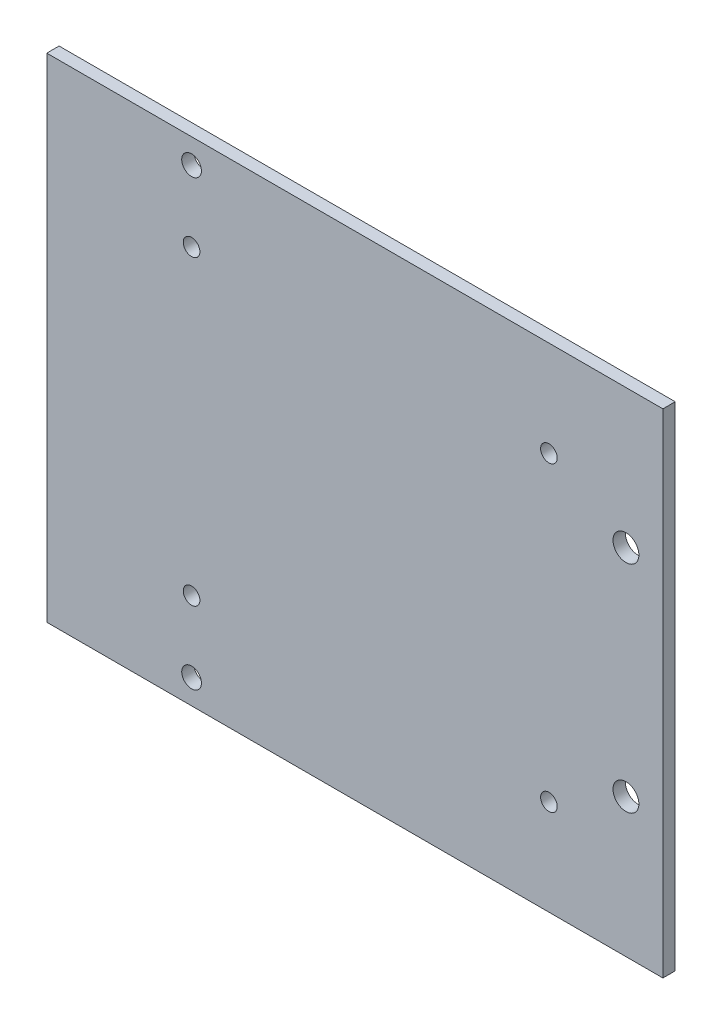
ISO-10303-21;
HEADER;
FILE_DESCRIPTION(('STEP AP214'),'2;1');
FILE_NAME('part.step','',(''),(''),'','','');
FILE_SCHEMA(('AUTOMOTIVE_DESIGN { 1 0 10303 214 1 1 1 1 }'));
ENDSEC;
DATA;
#1=APPLICATION_CONTEXT('core data for automotive mechanical design processes');
#2=APPLICATION_PROTOCOL_DEFINITION('international standard','automotive_design',2000,#1);
#3=PRODUCT_CONTEXT('',#1,'mechanical');
#4=PRODUCT('Part','Part','',(#3));
#5=PRODUCT_RELATED_PRODUCT_CATEGORY('part','',(#4));
#6=PRODUCT_DEFINITION_FORMATION('','',#4);
#7=PRODUCT_DEFINITION_CONTEXT('part definition',#1,'design');
#8=PRODUCT_DEFINITION('design','',#6,#7);
#9=PRODUCT_DEFINITION_SHAPE('','',#8);
#10=(LENGTH_UNIT() NAMED_UNIT(*) SI_UNIT(.MILLI.,.METRE.));
#11=(NAMED_UNIT(*) PLANE_ANGLE_UNIT() SI_UNIT($,.RADIAN.));
#12=(NAMED_UNIT(*) SI_UNIT($,.STERADIAN.) SOLID_ANGLE_UNIT());
#13=UNCERTAINTY_MEASURE_WITH_UNIT(LENGTH_MEASURE(1.E-05),#10,'distance_accuracy_value','');
#14=(GEOMETRIC_REPRESENTATION_CONTEXT(3) GLOBAL_UNCERTAINTY_ASSIGNED_CONTEXT((#13)) GLOBAL_UNIT_ASSIGNED_CONTEXT((#10,
#11,#12)) REPRESENTATION_CONTEXT('',''));
#15=CARTESIAN_POINT('',(0.,0.,0.));
#16=DIRECTION('',(0.,0.,1.));
#17=DIRECTION('',(1.,0.,0.));
#18=AXIS2_PLACEMENT_3D('',#15,#16,#17);
#19=CARTESIAN_POINT('',(0.,0.,2.));
#20=DIRECTION('',(0.,0.,1.));
#21=DIRECTION('',(1.,0.,0.));
#22=AXIS2_PLACEMENT_3D('',#19,#20,#21);
#23=PLANE('',#22);
#24=CARTESIAN_POINT('',(44.,-17.5,2.));
#25=DIRECTION('',(0.,0.,1.));
#26=DIRECTION('',(1.,0.,0.));
#27=AXIS2_PLACEMENT_3D('',#24,#25,#26);
#28=CIRCLE('',#27,2.09999999999999);
#29=CARTESIAN_POINT('',(46.1,-17.5,2.));
#30=VERTEX_POINT('',#29);
#31=EDGE_CURVE('E118',#30,#30,#28,.F.);
#32=ORIENTED_EDGE('',*,*,#31,.T.);
#33=EDGE_LOOP('',(#32));
#34=FACE_BOUND('',#33,.T.);
#35=CARTESIAN_POINT('',(-26.5,36.,2.));
#36=DIRECTION('',(0.,0.,1.));
#37=DIRECTION('',(1.,0.,0.));
#38=AXIS2_PLACEMENT_3D('',#35,#36,#37);
#39=CIRCLE('',#38,1.6);
#40=CARTESIAN_POINT('',(-24.9,36.,2.));
#41=VERTEX_POINT('',#40);
#42=EDGE_CURVE('E116',#41,#41,#39,.T.);
#43=ORIENTED_EDGE('',*,*,#42,.F.);
#44=EDGE_LOOP('',(#43));
#45=FACE_BOUND('',#44,.T.);
#46=CARTESIAN_POINT('',(-26.4999999999728,-36.0000000000007,2.));
#47=DIRECTION('',(0.,0.,-1.));
#48=DIRECTION('',(-1.,0.,0.));
#49=AXIS2_PLACEMENT_3D('',#46,#47,#48);
#50=CIRCLE('',#49,1.60000000001161);
#51=CARTESIAN_POINT('',(-28.0999999999844,-36.0000000000007,2.));
#52=VERTEX_POINT('',#51);
#53=EDGE_CURVE('E131',#52,#52,#50,.T.);
#54=ORIENTED_EDGE('',*,*,#53,.T.);
#55=EDGE_LOOP('',(#54));
#56=FACE_BOUND('',#55,.T.);
#57=CARTESIAN_POINT('',(-26.5,24.5,2.));
#58=DIRECTION('',(0.,0.,1.));
#59=DIRECTION('',(1.,0.,0.));
#60=AXIS2_PLACEMENT_3D('',#57,#58,#59);
#61=CIRCLE('',#60,1.35);
#62=CARTESIAN_POINT('',(-25.15,24.5,2.));
#63=VERTEX_POINT('',#62);
#64=EDGE_CURVE('E141',#63,#63,#61,.F.);
#65=ORIENTED_EDGE('',*,*,#64,.T.);
#66=EDGE_LOOP('',(#65));
#67=FACE_BOUND('',#66,.T.);
#68=CARTESIAN_POINT('',(-26.5,-24.5,2.));
#69=DIRECTION('',(0.,0.,1.));
#70=DIRECTION('',(1.,0.,0.));
#71=AXIS2_PLACEMENT_3D('',#68,#69,#70);
#72=CIRCLE('',#71,1.35);
#73=CARTESIAN_POINT('',(-25.15,-24.5,2.));
#74=VERTEX_POINT('',#73);
#75=EDGE_CURVE('E140',#74,#74,#72,.T.);
#76=ORIENTED_EDGE('',*,*,#75,.F.);
#77=EDGE_LOOP('',(#76));
#78=FACE_BOUND('',#77,.T.);
#79=DIRECTION('',(0.,1.,0.));
#80=VECTOR('',#79,1.);
#81=CARTESIAN_POINT('',(50.,40.,2.));
#82=LINE('',#81,#80);
#83=CARTESIAN_POINT('',(50.,-40.,2.));
#84=VERTEX_POINT('',#83);
#85=CARTESIAN_POINT('',(50.,40.,2.));
#86=VERTEX_POINT('',#85);
#87=EDGE_CURVE('E89',#84,#86,#82,.T.);
#88=ORIENTED_EDGE('',*,*,#87,.T.);
#89=DIRECTION('',(-1.,0.,0.));
#90=VECTOR('',#89,1.);
#91=CARTESIAN_POINT('',(-50.,40.,2.));
#92=LINE('',#91,#90);
#93=CARTESIAN_POINT('',(-50.,40.,2.));
#94=VERTEX_POINT('',#93);
#95=EDGE_CURVE('E84',#86,#94,#92,.T.);
#96=ORIENTED_EDGE('',*,*,#95,.T.);
#97=DIRECTION('',(0.,-1.,0.));
#98=VECTOR('',#97,1.);
#99=CARTESIAN_POINT('',(-50.,40.,2.));
#100=LINE('',#99,#98);
#101=CARTESIAN_POINT('',(-50.,-40.,2.));
#102=VERTEX_POINT('',#101);
#103=EDGE_CURVE('E87',#94,#102,#100,.T.);
#104=ORIENTED_EDGE('',*,*,#103,.T.);
#105=DIRECTION('',(1.,0.,0.));
#106=VECTOR('',#105,1.);
#107=CARTESIAN_POINT('',(-50.,-40.,2.));
#108=LINE('',#107,#106);
#109=EDGE_CURVE('E54',#102,#84,#108,.T.);
#110=ORIENTED_EDGE('',*,*,#109,.T.);
#111=EDGE_LOOP('',(#88,#96,#104,#110));
#112=FACE_BOUND('',#111,.T.);
#113=CARTESIAN_POINT('',(31.5,24.5,2.));
#114=DIRECTION('',(0.,0.,1.));
#115=DIRECTION('',(1.,0.,0.));
#116=AXIS2_PLACEMENT_3D('',#113,#114,#115);
#117=CIRCLE('',#116,1.35000000000001);
#118=CARTESIAN_POINT('',(32.85,24.5,2.));
#119=VERTEX_POINT('',#118);
#120=EDGE_CURVE('E147',#119,#119,#117,.T.);
#121=ORIENTED_EDGE('',*,*,#120,.F.);
#122=EDGE_LOOP('',(#121));
#123=FACE_BOUND('',#122,.T.);
#124=CARTESIAN_POINT('',(31.5,-24.5,2.));
#125=DIRECTION('',(0.,0.,1.));
#126=DIRECTION('',(1.,0.,0.));
#127=AXIS2_PLACEMENT_3D('',#124,#125,#126);
#128=CIRCLE('',#127,1.35000000000001);
#129=CARTESIAN_POINT('',(32.85,-24.5,2.));
#130=VERTEX_POINT('',#129);
#131=EDGE_CURVE('E134',#130,#130,#128,.F.);
#132=ORIENTED_EDGE('',*,*,#131,.T.);
#133=EDGE_LOOP('',(#132));
#134=FACE_BOUND('',#133,.T.);
#135=CARTESIAN_POINT('',(44.,17.5,2.));
#136=DIRECTION('',(0.,0.,1.));
#137=DIRECTION('',(1.,0.,0.));
#138=AXIS2_PLACEMENT_3D('',#135,#136,#137);
#139=CIRCLE('',#138,2.1);
#140=CARTESIAN_POINT('',(46.1,17.5,2.));
#141=VERTEX_POINT('',#140);
#142=EDGE_CURVE('E112',#141,#141,#139,.T.);
#143=ORIENTED_EDGE('',*,*,#142,.F.);
#144=EDGE_LOOP('',(#143));
#145=FACE_BOUND('',#144,.T.);
#146=ADVANCED_FACE('F35',(#34,#45,#56,#67,#78,#112,#123,#134,#145),#23,.T.);
#147=CARTESIAN_POINT('',(0.,0.,0.));
#148=DIRECTION('',(0.,0.,1.));
#149=DIRECTION('',(1.,0.,0.));
#150=AXIS2_PLACEMENT_3D('',#147,#148,#149);
#151=PLANE('',#150);
#152=CARTESIAN_POINT('',(31.5,-24.5,0.));
#153=DIRECTION('',(0.,0.,1.));
#154=DIRECTION('',(1.,0.,0.));
#155=AXIS2_PLACEMENT_3D('',#152,#153,#154);
#156=CIRCLE('',#155,1.35000000000001);
#157=CARTESIAN_POINT('',(32.85,-24.5,0.));
#158=VERTEX_POINT('',#157);
#159=EDGE_CURVE('E150',#158,#158,#156,.F.);
#160=ORIENTED_EDGE('',*,*,#159,.F.);
#161=EDGE_LOOP('',(#160));
#162=FACE_BOUND('',#161,.T.);
#163=CARTESIAN_POINT('',(-26.5,24.5,0.));
#164=DIRECTION('',(0.,0.,1.));
#165=DIRECTION('',(1.,0.,0.));
#166=AXIS2_PLACEMENT_3D('',#163,#164,#165);
#167=CIRCLE('',#166,1.35);
#168=CARTESIAN_POINT('',(-25.15,24.5,0.));
#169=VERTEX_POINT('',#168);
#170=EDGE_CURVE('E137',#169,#169,#167,.F.);
#171=ORIENTED_EDGE('',*,*,#170,.F.);
#172=EDGE_LOOP('',(#171));
#173=FACE_BOUND('',#172,.T.);
#174=DIRECTION('',(0.,1.,0.));
#175=VECTOR('',#174,1.);
#176=CARTESIAN_POINT('',(50.,40.,0.));
#177=LINE('',#176,#175);
#178=CARTESIAN_POINT('',(50.,-40.,0.));
#179=VERTEX_POINT('',#178);
#180=CARTESIAN_POINT('',(50.,40.,0.));
#181=VERTEX_POINT('',#180);
#182=EDGE_CURVE('E102',#179,#181,#177,.T.);
#183=ORIENTED_EDGE('',*,*,#182,.F.);
#184=DIRECTION('',(1.,0.,0.));
#185=VECTOR('',#184,1.);
#186=CARTESIAN_POINT('',(-50.,-40.,0.));
#187=LINE('',#186,#185);
#188=CARTESIAN_POINT('',(-50.,-40.,0.));
#189=VERTEX_POINT('',#188);
#190=EDGE_CURVE('E77',#189,#179,#187,.T.);
#191=ORIENTED_EDGE('',*,*,#190,.F.);
#192=DIRECTION('',(0.,-1.,0.));
#193=VECTOR('',#192,1.);
#194=CARTESIAN_POINT('',(-50.,40.,0.));
#195=LINE('',#194,#193);
#196=CARTESIAN_POINT('',(-50.,40.,0.));
#197=VERTEX_POINT('',#196);
#198=EDGE_CURVE('E71',#197,#189,#195,.T.);
#199=ORIENTED_EDGE('',*,*,#198,.F.);
#200=DIRECTION('',(-1.,0.,0.));
#201=VECTOR('',#200,1.);
#202=CARTESIAN_POINT('',(-50.,40.,0.));
#203=LINE('',#202,#201);
#204=EDGE_CURVE('E93',#181,#197,#203,.T.);
#205=ORIENTED_EDGE('',*,*,#204,.F.);
#206=EDGE_LOOP('',(#183,#191,#199,#205));
#207=FACE_BOUND('',#206,.T.);
#208=CARTESIAN_POINT('',(-26.5,-24.5,0.));
#209=DIRECTION('',(0.,0.,1.));
#210=DIRECTION('',(1.,0.,0.));
#211=AXIS2_PLACEMENT_3D('',#208,#209,#210);
#212=CIRCLE('',#211,1.35);
#213=CARTESIAN_POINT('',(-25.15,-24.5,0.));
#214=VERTEX_POINT('',#213);
#215=EDGE_CURVE('E105',#214,#214,#212,.T.);
#216=ORIENTED_EDGE('',*,*,#215,.T.);
#217=EDGE_LOOP('',(#216));
#218=FACE_BOUND('',#217,.T.);
#219=CARTESIAN_POINT('',(31.5,24.5,0.));
#220=DIRECTION('',(0.,0.,1.));
#221=DIRECTION('',(1.,0.,0.));
#222=AXIS2_PLACEMENT_3D('',#219,#220,#221);
#223=CIRCLE('',#222,1.35000000000001);
#224=CARTESIAN_POINT('',(32.85,24.5,0.));
#225=VERTEX_POINT('',#224);
#226=EDGE_CURVE('E144',#225,#225,#223,.T.);
#227=ORIENTED_EDGE('',*,*,#226,.T.);
#228=EDGE_LOOP('',(#227));
#229=FACE_BOUND('',#228,.T.);
#230=CARTESIAN_POINT('',(-26.4999999999728,-36.0000000000007,0.));
#231=DIRECTION('',(0.,0.,-1.));
#232=DIRECTION('',(-1.,0.,0.));
#233=AXIS2_PLACEMENT_3D('',#230,#231,#232);
#234=CIRCLE('',#233,1.60000000001161);
#235=CARTESIAN_POINT('',(-28.0999999999844,-36.0000000000007,0.));
#236=VERTEX_POINT('',#235);
#237=EDGE_CURVE('E128',#236,#236,#234,.T.);
#238=ORIENTED_EDGE('',*,*,#237,.F.);
#239=EDGE_LOOP('',(#238));
#240=FACE_BOUND('',#239,.T.);
#241=CARTESIAN_POINT('',(-26.5,36.,0.));
#242=DIRECTION('',(0.,0.,1.));
#243=DIRECTION('',(1.,0.,0.));
#244=AXIS2_PLACEMENT_3D('',#241,#242,#243);
#245=CIRCLE('',#244,1.6);
#246=CARTESIAN_POINT('',(-24.9,36.,0.));
#247=VERTEX_POINT('',#246);
#248=EDGE_CURVE('E125',#247,#247,#245,.T.);
#249=ORIENTED_EDGE('',*,*,#248,.T.);
#250=EDGE_LOOP('',(#249));
#251=FACE_BOUND('',#250,.T.);
#252=CARTESIAN_POINT('',(44.,-17.5,0.));
#253=DIRECTION('',(0.,0.,1.));
#254=DIRECTION('',(1.,0.,0.));
#255=AXIS2_PLACEMENT_3D('',#252,#253,#254);
#256=CIRCLE('',#255,2.09999999999999);
#257=CARTESIAN_POINT('',(46.1,-17.5,0.));
#258=VERTEX_POINT('',#257);
#259=EDGE_CURVE('E110',#258,#258,#256,.F.);
#260=ORIENTED_EDGE('',*,*,#259,.F.);
#261=EDGE_LOOP('',(#260));
#262=FACE_BOUND('',#261,.T.);
#263=CARTESIAN_POINT('',(44.,17.5,0.));
#264=DIRECTION('',(0.,0.,1.));
#265=DIRECTION('',(1.,0.,0.));
#266=AXIS2_PLACEMENT_3D('',#263,#264,#265);
#267=CIRCLE('',#266,2.1);
#268=CARTESIAN_POINT('',(46.1,17.5,0.));
#269=VERTEX_POINT('',#268);
#270=EDGE_CURVE('E39',#269,#269,#267,.T.);
#271=ORIENTED_EDGE('',*,*,#270,.T.);
#272=EDGE_LOOP('',(#271));
#273=FACE_BOUND('',#272,.T.);
#274=ADVANCED_FACE('F163',(#162,#173,#207,#218,#229,#240,#251,#262,#273),#151,.F.);
#275=CARTESIAN_POINT('',(50.,40.,2.));
#276=DIRECTION('',(-1.,0.,0.));
#277=DIRECTION('',(0.,-1.,0.));
#278=AXIS2_PLACEMENT_3D('',#275,#276,#277);
#279=PLANE('',#278);
#280=ORIENTED_EDGE('',*,*,#182,.T.);
#281=DIRECTION('',(0.,0.,-1.));
#282=VECTOR('',#281,1.);
#283=CARTESIAN_POINT('',(50.,40.,2.));
#284=LINE('',#283,#282);
#285=EDGE_CURVE('E11',#86,#181,#284,.T.);
#286=ORIENTED_EDGE('',*,*,#285,.F.);
#287=ORIENTED_EDGE('',*,*,#87,.F.);
#288=DIRECTION('',(0.,0.,-1.));
#289=VECTOR('',#288,1.);
#290=CARTESIAN_POINT('',(50.,-40.,2.));
#291=LINE('',#290,#289);
#292=EDGE_CURVE('E98',#84,#179,#291,.T.);
#293=ORIENTED_EDGE('',*,*,#292,.T.);
#294=EDGE_LOOP('',(#280,#286,#287,#293));
#295=FACE_BOUND('',#294,.T.);
#296=ADVANCED_FACE('F37',(#295),#279,.F.);
#297=CARTESIAN_POINT('',(-50.,40.,2.));
#298=DIRECTION('',(0.,-1.,0.));
#299=DIRECTION('',(0.,0.,-1.));
#300=AXIS2_PLACEMENT_3D('',#297,#298,#299);
#301=PLANE('',#300);
#302=ORIENTED_EDGE('',*,*,#204,.T.);
#303=DIRECTION('',(0.,0.,-1.));
#304=VECTOR('',#303,1.);
#305=CARTESIAN_POINT('',(-50.,40.,2.));
#306=LINE('',#305,#304);
#307=EDGE_CURVE('E45',#94,#197,#306,.T.);
#308=ORIENTED_EDGE('',*,*,#307,.F.);
#309=ORIENTED_EDGE('',*,*,#95,.F.);
#310=ORIENTED_EDGE('',*,*,#285,.T.);
#311=EDGE_LOOP('',(#302,#308,#309,#310));
#312=FACE_BOUND('',#311,.T.);
#313=ADVANCED_FACE('F92',(#312),#301,.F.);
#314=CARTESIAN_POINT('',(-50.,40.,2.));
#315=DIRECTION('',(1.,0.,0.));
#316=DIRECTION('',(0.,1.,0.));
#317=AXIS2_PLACEMENT_3D('',#314,#315,#316);
#318=PLANE('',#317);
#319=ORIENTED_EDGE('',*,*,#198,.T.);
#320=DIRECTION('',(0.,0.,-1.));
#321=VECTOR('',#320,1.);
#322=CARTESIAN_POINT('',(-50.,-40.,2.));
#323=LINE('',#322,#321);
#324=EDGE_CURVE('E94',#102,#189,#323,.T.);
#325=ORIENTED_EDGE('',*,*,#324,.F.);
#326=ORIENTED_EDGE('',*,*,#103,.F.);
#327=ORIENTED_EDGE('',*,*,#307,.T.);
#328=EDGE_LOOP('',(#319,#325,#326,#327));
#329=FACE_BOUND('',#328,.T.);
#330=ADVANCED_FACE('F96',(#329),#318,.F.);
#331=CARTESIAN_POINT('',(-50.,-40.,2.));
#332=DIRECTION('',(0.,1.,0.));
#333=DIRECTION('',(0.,0.,1.));
#334=AXIS2_PLACEMENT_3D('',#331,#332,#333);
#335=PLANE('',#334);
#336=ORIENTED_EDGE('',*,*,#190,.T.);
#337=ORIENTED_EDGE('',*,*,#292,.F.);
#338=ORIENTED_EDGE('',*,*,#109,.F.);
#339=ORIENTED_EDGE('',*,*,#324,.T.);
#340=EDGE_LOOP('',(#336,#337,#338,#339));
#341=FACE_BOUND('',#340,.T.);
#342=ADVANCED_FACE('F176',(#341),#335,.F.);
#343=CARTESIAN_POINT('',(-26.5,-24.5,0.));
#344=DIRECTION('',(0.,0.,1.));
#345=DIRECTION('',(1.,0.,0.));
#346=AXIS2_PLACEMENT_3D('',#343,#344,#345);
#347=CYLINDRICAL_SURFACE('',#346,1.35);
#348=ORIENTED_EDGE('',*,*,#215,.F.);
#349=EDGE_LOOP('',(#348));
#350=FACE_BOUND('',#349,.T.);
#351=ORIENTED_EDGE('',*,*,#75,.T.);
#352=EDGE_LOOP('',(#351));
#353=FACE_BOUND('',#352,.T.);
#354=ADVANCED_FACE('F160',(#350,#353),#347,.F.);
#355=CARTESIAN_POINT('',(-26.5,24.5,0.));
#356=DIRECTION('',(0.,0.,1.));
#357=DIRECTION('',(1.,0.,0.));
#358=AXIS2_PLACEMENT_3D('',#355,#356,#357);
#359=CYLINDRICAL_SURFACE('',#358,1.35);
#360=ORIENTED_EDGE('',*,*,#170,.T.);
#361=EDGE_LOOP('',(#360));
#362=FACE_BOUND('',#361,.T.);
#363=ORIENTED_EDGE('',*,*,#64,.F.);
#364=EDGE_LOOP('',(#363));
#365=FACE_BOUND('',#364,.T.);
#366=ADVANCED_FACE('F220',(#362,#365),#359,.F.);
#367=CARTESIAN_POINT('',(31.5,24.5,0.));
#368=DIRECTION('',(0.,0.,1.));
#369=DIRECTION('',(1.,0.,0.));
#370=AXIS2_PLACEMENT_3D('',#367,#368,#369);
#371=CYLINDRICAL_SURFACE('',#370,1.35000000000001);
#372=ORIENTED_EDGE('',*,*,#226,.F.);
#373=EDGE_LOOP('',(#372));
#374=FACE_BOUND('',#373,.T.);
#375=ORIENTED_EDGE('',*,*,#120,.T.);
#376=EDGE_LOOP('',(#375));
#377=FACE_BOUND('',#376,.T.);
#378=ADVANCED_FACE('F223',(#374,#377),#371,.F.);
#379=CARTESIAN_POINT('',(31.5,-24.5,0.));
#380=DIRECTION('',(0.,0.,1.));
#381=DIRECTION('',(1.,0.,0.));
#382=AXIS2_PLACEMENT_3D('',#379,#380,#381);
#383=CYLINDRICAL_SURFACE('',#382,1.35000000000001);
#384=ORIENTED_EDGE('',*,*,#159,.T.);
#385=EDGE_LOOP('',(#384));
#386=FACE_BOUND('',#385,.T.);
#387=ORIENTED_EDGE('',*,*,#131,.F.);
#388=EDGE_LOOP('',(#387));
#389=FACE_BOUND('',#388,.T.);
#390=ADVANCED_FACE('F218',(#386,#389),#383,.F.);
#391=CARTESIAN_POINT('',(-26.4999999999728,-36.0000000000007,2.));
#392=DIRECTION('',(0.,0.,-1.));
#393=DIRECTION('',(-1.,0.,0.));
#394=AXIS2_PLACEMENT_3D('',#391,#392,#393);
#395=CYLINDRICAL_SURFACE('',#394,1.60000000001161);
#396=ORIENTED_EDGE('',*,*,#53,.F.);
#397=EDGE_LOOP('',(#396));
#398=FACE_BOUND('',#397,.T.);
#399=ORIENTED_EDGE('',*,*,#237,.T.);
#400=EDGE_LOOP('',(#399));
#401=FACE_BOUND('',#400,.T.);
#402=ADVANCED_FACE('F214',(#398,#401),#395,.F.);
#403=CARTESIAN_POINT('',(-26.5,36.,0.));
#404=DIRECTION('',(0.,0.,1.));
#405=DIRECTION('',(1.,0.,0.));
#406=AXIS2_PLACEMENT_3D('',#403,#404,#405);
#407=CYLINDRICAL_SURFACE('',#406,1.6);
#408=ORIENTED_EDGE('',*,*,#248,.F.);
#409=EDGE_LOOP('',(#408));
#410=FACE_BOUND('',#409,.T.);
#411=ORIENTED_EDGE('',*,*,#42,.T.);
#412=EDGE_LOOP('',(#411));
#413=FACE_BOUND('',#412,.T.);
#414=ADVANCED_FACE('F208',(#410,#413),#407,.F.);
#415=CARTESIAN_POINT('',(44.,-17.5,-8.));
#416=DIRECTION('',(0.,0.,1.));
#417=DIRECTION('',(1.,0.,0.));
#418=AXIS2_PLACEMENT_3D('',#415,#416,#417);
#419=CYLINDRICAL_SURFACE('',#418,2.09999999999999);
#420=ORIENTED_EDGE('',*,*,#31,.F.);
#421=EDGE_LOOP('',(#420));
#422=FACE_BOUND('',#421,.T.);
#423=ORIENTED_EDGE('',*,*,#259,.T.);
#424=EDGE_LOOP('',(#423));
#425=FACE_BOUND('',#424,.T.);
#426=ADVANCED_FACE('F203',(#422,#425),#419,.F.);
#427=CARTESIAN_POINT('',(44.,17.5,-8.));
#428=DIRECTION('',(0.,0.,1.));
#429=DIRECTION('',(1.,0.,0.));
#430=AXIS2_PLACEMENT_3D('',#427,#428,#429);
#431=CYLINDRICAL_SURFACE('',#430,2.1);
#432=ORIENTED_EDGE('',*,*,#142,.T.);
#433=EDGE_LOOP('',(#432));
#434=FACE_BOUND('',#433,.T.);
#435=ORIENTED_EDGE('',*,*,#270,.F.);
#436=EDGE_LOOP('',(#435));
#437=FACE_BOUND('',#436,.T.);
#438=ADVANCED_FACE('F201',(#434,#437),#431,.F.);
#439=CLOSED_SHELL('',(#146,#274,#296,#313,#330,#342,#354,#366,#378,#390,#402,#414,#426,#438));
#440=MANIFOLD_SOLID_BREP('B2',#439);
#441=ADVANCED_BREP_SHAPE_REPRESENTATION('',(#18,#440),#14);
#442=SHAPE_DEFINITION_REPRESENTATION(#9,#441);
ENDSEC;
END-ISO-10303-21;
